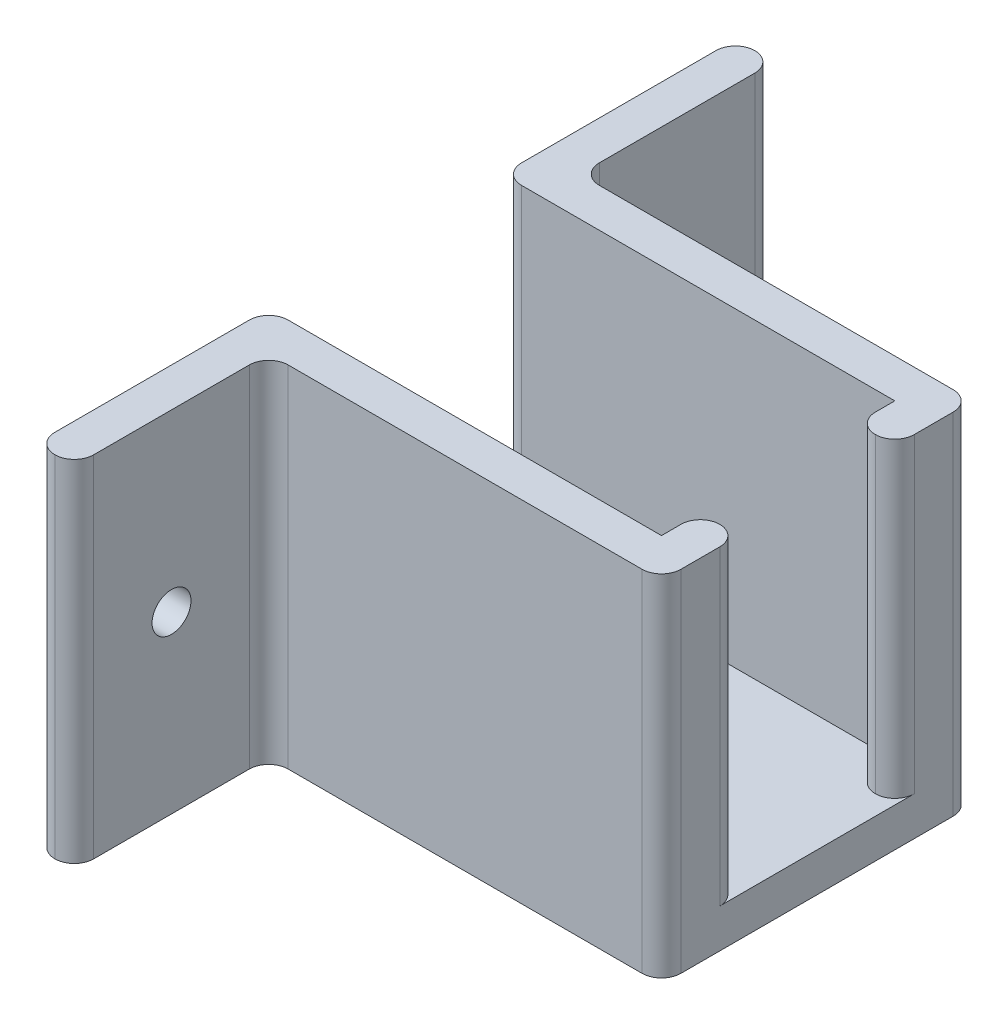
ISO-10303-21;
HEADER;
FILE_DESCRIPTION(('STEP AP214'),'2;1');
FILE_NAME('part.step','',(''),(''),'','','');
FILE_SCHEMA(('AUTOMOTIVE_DESIGN { 1 0 10303 214 1 1 1 1 }'));
ENDSEC;
DATA;
#1=APPLICATION_CONTEXT('core data for automotive mechanical design processes');
#2=APPLICATION_PROTOCOL_DEFINITION('international standard','automotive_design',2000,#1);
#3=PRODUCT_CONTEXT('',#1,'mechanical');
#4=PRODUCT('Part','Part','',(#3));
#5=PRODUCT_RELATED_PRODUCT_CATEGORY('part','',(#4));
#6=PRODUCT_DEFINITION_FORMATION('','',#4);
#7=PRODUCT_DEFINITION_CONTEXT('part definition',#1,'design');
#8=PRODUCT_DEFINITION('design','',#6,#7);
#9=PRODUCT_DEFINITION_SHAPE('','',#8);
#10=(LENGTH_UNIT() NAMED_UNIT(*) SI_UNIT(.MILLI.,.METRE.));
#11=(NAMED_UNIT(*) PLANE_ANGLE_UNIT() SI_UNIT($,.RADIAN.));
#12=(NAMED_UNIT(*) SI_UNIT($,.STERADIAN.) SOLID_ANGLE_UNIT());
#13=UNCERTAINTY_MEASURE_WITH_UNIT(LENGTH_MEASURE(1.E-05),#10,'distance_accuracy_value','');
#14=(GEOMETRIC_REPRESENTATION_CONTEXT(3) GLOBAL_UNCERTAINTY_ASSIGNED_CONTEXT((#13)) GLOBAL_UNIT_ASSIGNED_CONTEXT((#10,
#11,#12)) REPRESENTATION_CONTEXT('',''));
#15=CARTESIAN_POINT('',(0.,0.,0.));
#16=DIRECTION('',(0.,0.,1.));
#17=DIRECTION('',(1.,0.,0.));
#18=AXIS2_PLACEMENT_3D('',#15,#16,#17);
#19=CARTESIAN_POINT('',(0.,0.,0.));
#20=DIRECTION('',(0.,-1.,0.));
#21=DIRECTION('',(0.,0.,-1.));
#22=AXIS2_PLACEMENT_3D('',#19,#20,#21);
#23=PLANE('',#22);
#24=CARTESIAN_POINT('',(23.2,0.,-1.));
#25=DIRECTION('',(0.,-1.,0.));
#26=DIRECTION('',(0.,0.,-1.));
#27=AXIS2_PLACEMENT_3D('',#24,#25,#26);
#28=CIRCLE('',#27,1.);
#29=CARTESIAN_POINT('',(22.2,0.,-1.));
#30=VERTEX_POINT('',#29);
#31=CARTESIAN_POINT('',(23.2,0.,-2.));
#32=VERTEX_POINT('',#31);
#33=EDGE_CURVE('E52',#30,#32,#28,.T.);
#34=ORIENTED_EDGE('',*,*,#33,.T.);
#35=CARTESIAN_POINT('',(23.2,0.,-1.));
#36=DIRECTION('',(0.,-1.,0.));
#37=DIRECTION('',(0.,0.,-1.));
#38=AXIS2_PLACEMENT_3D('',#35,#36,#37);
#39=CIRCLE('',#38,1.);
#40=CARTESIAN_POINT('',(24.2,0.,-1.));
#41=VERTEX_POINT('',#40);
#42=EDGE_CURVE('E11',#32,#41,#39,.T.);
#43=ORIENTED_EDGE('',*,*,#42,.T.);
#44=DIRECTION('',(0.,0.,1.));
#45=VECTOR('',#44,1.);
#46=CARTESIAN_POINT('',(24.2,0.,0.));
#47=LINE('',#46,#45);
#48=CARTESIAN_POINT('',(24.2,0.,-11.));
#49=VERTEX_POINT('',#48);
#50=EDGE_CURVE('E252',#49,#41,#47,.T.);
#51=ORIENTED_EDGE('',*,*,#50,.F.);
#52=CARTESIAN_POINT('',(23.2,0.,-11.));
#53=DIRECTION('',(0.,-1.,0.));
#54=DIRECTION('',(0.,0.,-1.));
#55=AXIS2_PLACEMENT_3D('',#52,#53,#54);
#56=CIRCLE('',#55,1.);
#57=CARTESIAN_POINT('',(23.2,0.,-9.99999999999999));
#58=VERTEX_POINT('',#57);
#59=EDGE_CURVE('E65',#49,#58,#56,.T.);
#60=ORIENTED_EDGE('',*,*,#59,.T.);
#61=CARTESIAN_POINT('',(23.2,0.,-11.));
#62=DIRECTION('',(0.,-1.,0.));
#63=DIRECTION('',(0.,0.,-1.));
#64=AXIS2_PLACEMENT_3D('',#61,#62,#63);
#65=CIRCLE('',#64,1.);
#66=CARTESIAN_POINT('',(22.2,0.,-11.));
#67=VERTEX_POINT('',#66);
#68=EDGE_CURVE('E393',#58,#67,#65,.T.);
#69=ORIENTED_EDGE('',*,*,#68,.T.);
#70=DIRECTION('',(0.,0.,1.));
#71=VECTOR('',#70,1.);
#72=CARTESIAN_POINT('',(22.2,0.,0.));
#73=LINE('',#72,#71);
#74=CARTESIAN_POINT('',(22.2,0.,-12.));
#75=VERTEX_POINT('',#74);
#76=EDGE_CURVE('E253',#75,#67,#73,.T.);
#77=ORIENTED_EDGE('',*,*,#76,.F.);
#78=DIRECTION('',(1.,0.,0.));
#79=VECTOR('',#78,1.);
#80=CARTESIAN_POINT('',(0.,0.,-12.));
#81=LINE('',#80,#79);
#82=CARTESIAN_POINT('',(3.,0.,-12.));
#83=VERTEX_POINT('',#82);
#84=EDGE_CURVE('E250',#83,#75,#81,.T.);
#85=ORIENTED_EDGE('',*,*,#84,.F.);
#86=CARTESIAN_POINT('',(3.,0.,-13.));
#87=DIRECTION('',(0.,-1.,0.));
#88=DIRECTION('',(0.,0.,-1.));
#89=AXIS2_PLACEMENT_3D('',#86,#87,#88);
#90=CIRCLE('',#89,1.);
#91=CARTESIAN_POINT('',(2.,0.,-13.));
#92=VERTEX_POINT('',#91);
#93=EDGE_CURVE('E383',#83,#92,#90,.T.);
#94=ORIENTED_EDGE('',*,*,#93,.T.);
#95=DIRECTION('',(0.,0.,1.));
#96=VECTOR('',#95,1.);
#97=CARTESIAN_POINT('',(2.,0.,0.));
#98=LINE('',#97,#96);
#99=CARTESIAN_POINT('',(2.,0.,1.));
#100=VERTEX_POINT('',#99);
#101=EDGE_CURVE('E279',#92,#100,#98,.T.);
#102=ORIENTED_EDGE('',*,*,#101,.T.);
#103=CARTESIAN_POINT('',(3.,0.,1.));
#104=DIRECTION('',(0.,-1.,0.));
#105=DIRECTION('',(0.,0.,-1.));
#106=AXIS2_PLACEMENT_3D('',#103,#104,#105);
#107=CIRCLE('',#106,1.);
#108=CARTESIAN_POINT('',(3.,0.,0.));
#109=VERTEX_POINT('',#108);
#110=EDGE_CURVE('E386',#100,#109,#107,.T.);
#111=ORIENTED_EDGE('',*,*,#110,.T.);
#112=DIRECTION('',(-1.,0.,0.));
#113=VECTOR('',#112,1.);
#114=CARTESIAN_POINT('',(0.,0.,0.));
#115=LINE('',#114,#113);
#116=CARTESIAN_POINT('',(22.2,0.,0.));
#117=VERTEX_POINT('',#116);
#118=EDGE_CURVE('E238',#117,#109,#115,.T.);
#119=ORIENTED_EDGE('',*,*,#118,.F.);
#120=DIRECTION('',(0.,0.,1.));
#121=VECTOR('',#120,1.);
#122=CARTESIAN_POINT('',(22.2,0.,0.));
#123=LINE('',#122,#121);
#124=EDGE_CURVE('E234',#30,#117,#123,.T.);
#125=ORIENTED_EDGE('',*,*,#124,.F.);
#126=EDGE_LOOP('',(#34,#43,#51,#60,#69,#77,#85,#94,#102,#111,#119,#125));
#127=FACE_BOUND('',#126,.T.);
#128=ADVANCED_FACE('F43',(#127),#23,.F.);
#129=CARTESIAN_POINT('',(24.2,-2.,0.));
#130=DIRECTION('',(-1.,0.,0.));
#131=DIRECTION('',(0.,0.,1.));
#132=AXIS2_PLACEMENT_3D('',#129,#130,#131);
#133=PLANE('',#132);
#134=DIRECTION('',(0.,0.,1.));
#135=VECTOR('',#134,1.);
#136=CARTESIAN_POINT('',(24.2,-2.,0.));
#137=LINE('',#136,#135);
#138=CARTESIAN_POINT('',(24.2,-2.,-13.));
#139=VERTEX_POINT('',#138);
#140=CARTESIAN_POINT('',(24.2,-2.,1.));
#141=VERTEX_POINT('',#140);
#142=EDGE_CURVE('E275',#139,#141,#137,.T.);
#143=ORIENTED_EDGE('',*,*,#142,.F.);
#144=DIRECTION('',(0.,1.,0.));
#145=VECTOR('',#144,1.);
#146=CARTESIAN_POINT('',(24.2,-2.,-13.));
#147=LINE('',#146,#145);
#148=CARTESIAN_POINT('',(24.2,16.,-13.));
#149=VERTEX_POINT('',#148);
#150=EDGE_CURVE('E303',#139,#149,#147,.T.);
#151=ORIENTED_EDGE('',*,*,#150,.T.);
#152=DIRECTION('',(0.,0.,1.));
#153=VECTOR('',#152,1.);
#154=CARTESIAN_POINT('',(24.2,16.,0.));
#155=LINE('',#154,#153);
#156=CARTESIAN_POINT('',(24.2,16.,-11.));
#157=VERTEX_POINT('',#156);
#158=EDGE_CURVE('E265',#149,#157,#155,.T.);
#159=ORIENTED_EDGE('',*,*,#158,.T.);
#160=DIRECTION('',(0.,-1.,0.));
#161=VECTOR('',#160,1.);
#162=CARTESIAN_POINT('',(24.2,0.,-11.));
#163=LINE('',#162,#161);
#164=EDGE_CURVE('E298',#157,#49,#163,.T.);
#165=ORIENTED_EDGE('',*,*,#164,.T.);
#166=ORIENTED_EDGE('',*,*,#50,.T.);
#167=DIRECTION('',(0.,-1.,0.));
#168=VECTOR('',#167,1.);
#169=CARTESIAN_POINT('',(24.2,-2.,-1.));
#170=LINE('',#169,#168);
#171=CARTESIAN_POINT('',(24.2,16.,-1.));
#172=VERTEX_POINT('',#171);
#173=EDGE_CURVE('E294',#41,#172,#170,.F.);
#174=ORIENTED_EDGE('',*,*,#173,.T.);
#175=DIRECTION('',(0.,0.,1.));
#176=VECTOR('',#175,1.);
#177=CARTESIAN_POINT('',(24.2,16.,0.));
#178=LINE('',#177,#176);
#179=CARTESIAN_POINT('',(24.2,16.,1.));
#180=VERTEX_POINT('',#179);
#181=EDGE_CURVE('E420',#172,#180,#178,.T.);
#182=ORIENTED_EDGE('',*,*,#181,.T.);
#183=DIRECTION('',(0.,1.,0.));
#184=VECTOR('',#183,1.);
#185=CARTESIAN_POINT('',(24.2,-2.,1.));
#186=LINE('',#185,#184);
#187=EDGE_CURVE('E301',#180,#141,#186,.F.);
#188=ORIENTED_EDGE('',*,*,#187,.T.);
#189=EDGE_LOOP('',(#143,#151,#159,#165,#166,#174,#182,#188));
#190=FACE_BOUND('',#189,.T.);
#191=ADVANCED_FACE('F457',(#190),#133,.F.);
#192=CARTESIAN_POINT('',(0.,-2.,2.));
#193=DIRECTION('',(0.,0.,-1.));
#194=DIRECTION('',(-1.,0.,0.));
#195=AXIS2_PLACEMENT_3D('',#192,#193,#194);
#196=PLANE('',#195);
#197=DIRECTION('',(-1.,0.,0.));
#198=VECTOR('',#197,1.);
#199=CARTESIAN_POINT('',(0.,-2.,2.));
#200=LINE('',#199,#198);
#201=CARTESIAN_POINT('',(23.2,-2.,2.));
#202=VERTEX_POINT('',#201);
#203=CARTESIAN_POINT('',(5.,-2.,2.));
#204=VERTEX_POINT('',#203);
#205=EDGE_CURVE('E278',#202,#204,#200,.T.);
#206=ORIENTED_EDGE('',*,*,#205,.F.);
#207=DIRECTION('',(0.,1.,0.));
#208=VECTOR('',#207,1.);
#209=CARTESIAN_POINT('',(23.2,-2.,2.));
#210=LINE('',#209,#208);
#211=CARTESIAN_POINT('',(23.2,16.,2.));
#212=VERTEX_POINT('',#211);
#213=EDGE_CURVE('E337',#202,#212,#210,.T.);
#214=ORIENTED_EDGE('',*,*,#213,.T.);
#215=DIRECTION('',(-1.,0.,0.));
#216=VECTOR('',#215,1.);
#217=CARTESIAN_POINT('',(0.,16.,2.));
#218=LINE('',#217,#216);
#219=CARTESIAN_POINT('',(5.,16.,2.));
#220=VERTEX_POINT('',#219);
#221=EDGE_CURVE('E399',#212,#220,#218,.T.);
#222=ORIENTED_EDGE('',*,*,#221,.T.);
#223=DIRECTION('',(0.,1.,0.));
#224=VECTOR('',#223,1.);
#225=CARTESIAN_POINT('',(5.,-2.,2.));
#226=LINE('',#225,#224);
#227=EDGE_CURVE('E335',#220,#204,#226,.F.);
#228=ORIENTED_EDGE('',*,*,#227,.T.);
#229=EDGE_LOOP('',(#206,#214,#222,#228));
#230=FACE_BOUND('',#229,.T.);
#231=ADVANCED_FACE('F447',(#230),#196,.F.);
#232=CARTESIAN_POINT('',(4.,-2.,0.));
#233=DIRECTION('',(1.,0.,0.));
#234=DIRECTION('',(0.,0.,-1.));
#235=AXIS2_PLACEMENT_3D('',#232,#233,#234);
#236=PLANE('',#235);
#237=CARTESIAN_POINT('',(4.,7.,7.));
#238=DIRECTION('',(1.,0.,0.));
#239=DIRECTION('',(0.,0.,-1.));
#240=AXIS2_PLACEMENT_3D('',#237,#238,#239);
#241=CIRCLE('',#240,1.);
#242=CARTESIAN_POINT('',(4.,7.,6.));
#243=VERTEX_POINT('',#242);
#244=EDGE_CURVE('E407',#243,#243,#241,.T.);
#245=ORIENTED_EDGE('',*,*,#244,.F.);
#246=EDGE_LOOP('',(#245));
#247=FACE_BOUND('',#246,.T.);
#248=DIRECTION('',(0.,0.,-1.));
#249=VECTOR('',#248,1.);
#250=CARTESIAN_POINT('',(4.,16.,0.));
#251=LINE('',#250,#249);
#252=CARTESIAN_POINT('',(4.,16.,11.));
#253=VERTEX_POINT('',#252);
#254=CARTESIAN_POINT('',(4.,16.,3.));
#255=VERTEX_POINT('',#254);
#256=EDGE_CURVE('E229',#253,#255,#251,.T.);
#257=ORIENTED_EDGE('',*,*,#256,.F.);
#258=DIRECTION('',(0.,1.,0.));
#259=VECTOR('',#258,1.);
#260=CARTESIAN_POINT('',(4.,-2.,11.));
#261=LINE('',#260,#259);
#262=CARTESIAN_POINT('',(4.,-2.,11.));
#263=VERTEX_POINT('',#262);
#264=EDGE_CURVE('E373',#253,#263,#261,.F.);
#265=ORIENTED_EDGE('',*,*,#264,.T.);
#266=DIRECTION('',(0.,0.,-1.));
#267=VECTOR('',#266,1.);
#268=CARTESIAN_POINT('',(4.,-2.,0.));
#269=LINE('',#268,#267);
#270=CARTESIAN_POINT('',(4.,-2.,3.));
#271=VERTEX_POINT('',#270);
#272=EDGE_CURVE('E282',#263,#271,#269,.T.);
#273=ORIENTED_EDGE('',*,*,#272,.T.);
#274=DIRECTION('',(0.,1.,0.));
#275=VECTOR('',#274,1.);
#276=CARTESIAN_POINT('',(4.,-2.,3.));
#277=LINE('',#276,#275);
#278=EDGE_CURVE('E370',#271,#255,#277,.T.);
#279=ORIENTED_EDGE('',*,*,#278,.T.);
#280=EDGE_LOOP('',(#257,#265,#273,#279));
#281=FACE_BOUND('',#280,.T.);
#282=ADVANCED_FACE('F430',(#247,#281),#236,.T.);
#283=CARTESIAN_POINT('',(2.,-2.,0.));
#284=DIRECTION('',(-1.,0.,0.));
#285=DIRECTION('',(0.,0.,1.));
#286=AXIS2_PLACEMENT_3D('',#283,#284,#285);
#287=PLANE('',#286);
#288=CARTESIAN_POINT('',(2.,6.99999999999999,-19.));
#289=DIRECTION('',(-1.,0.,0.));
#290=DIRECTION('',(0.,0.,1.));
#291=AXIS2_PLACEMENT_3D('',#288,#289,#290);
#292=CIRCLE('',#291,1.);
#293=CARTESIAN_POINT('',(2.,6.99999999999999,-18.));
#294=VERTEX_POINT('',#293);
#295=EDGE_CURVE('E415',#294,#294,#292,.T.);
#296=ORIENTED_EDGE('',*,*,#295,.F.);
#297=EDGE_LOOP('',(#296));
#298=FACE_BOUND('',#297,.T.);
#299=CARTESIAN_POINT('',(2.,7.,7.));
#300=DIRECTION('',(-1.,0.,0.));
#301=DIRECTION('',(0.,0.,1.));
#302=AXIS2_PLACEMENT_3D('',#299,#300,#301);
#303=CIRCLE('',#302,1.);
#304=CARTESIAN_POINT('',(2.,7.,8.));
#305=VERTEX_POINT('',#304);
#306=EDGE_CURVE('E418',#305,#305,#303,.T.);
#307=ORIENTED_EDGE('',*,*,#306,.F.);
#308=EDGE_LOOP('',(#307));
#309=FACE_BOUND('',#308,.T.);
#310=DIRECTION('',(0.,0.,1.));
#311=VECTOR('',#310,1.);
#312=CARTESIAN_POINT('',(2.,16.,0.));
#313=LINE('',#312,#311);
#314=CARTESIAN_POINT('',(2.,16.,-23.));
#315=VERTEX_POINT('',#314);
#316=CARTESIAN_POINT('',(2.,16.,-13.));
#317=VERTEX_POINT('',#316);
#318=EDGE_CURVE('E228',#315,#317,#313,.T.);
#319=ORIENTED_EDGE('',*,*,#318,.F.);
#320=DIRECTION('',(0.,1.,0.));
#321=VECTOR('',#320,1.);
#322=CARTESIAN_POINT('',(2.,-2.,-23.));
#323=LINE('',#322,#321);
#324=CARTESIAN_POINT('',(2.,-2.,-23.));
#325=VERTEX_POINT('',#324);
#326=EDGE_CURVE('E359',#315,#325,#323,.F.);
#327=ORIENTED_EDGE('',*,*,#326,.T.);
#328=DIRECTION('',(0.,0.,1.));
#329=VECTOR('',#328,1.);
#330=CARTESIAN_POINT('',(2.,-2.,0.));
#331=LINE('',#330,#329);
#332=CARTESIAN_POINT('',(2.,-2.,11.));
#333=VERTEX_POINT('',#332);
#334=EDGE_CURVE('E285',#325,#333,#331,.T.);
#335=ORIENTED_EDGE('',*,*,#334,.T.);
#336=DIRECTION('',(0.,1.,0.));
#337=VECTOR('',#336,1.);
#338=CARTESIAN_POINT('',(2.,-2.,11.));
#339=LINE('',#338,#337);
#340=CARTESIAN_POINT('',(2.,16.,11.));
#341=VERTEX_POINT('',#340);
#342=EDGE_CURVE('E351',#333,#341,#339,.T.);
#343=ORIENTED_EDGE('',*,*,#342,.T.);
#344=DIRECTION('',(0.,0.,1.));
#345=VECTOR('',#344,1.);
#346=CARTESIAN_POINT('',(2.,16.,0.));
#347=LINE('',#346,#345);
#348=CARTESIAN_POINT('',(2.,16.,1.));
#349=VERTEX_POINT('',#348);
#350=EDGE_CURVE('E243',#349,#341,#347,.T.);
#351=ORIENTED_EDGE('',*,*,#350,.F.);
#352=DIRECTION('',(0.,-1.,0.));
#353=VECTOR('',#352,1.);
#354=CARTESIAN_POINT('',(2.,0.,1.));
#355=LINE('',#354,#353);
#356=EDGE_CURVE('E354',#349,#100,#355,.T.);
#357=ORIENTED_EDGE('',*,*,#356,.T.);
#358=ORIENTED_EDGE('',*,*,#101,.F.);
#359=DIRECTION('',(0.,-1.,0.));
#360=VECTOR('',#359,1.);
#361=CARTESIAN_POINT('',(2.,16.,-13.));
#362=LINE('',#361,#360);
#363=EDGE_CURVE('E357',#92,#317,#362,.F.);
#364=ORIENTED_EDGE('',*,*,#363,.T.);
#365=EDGE_LOOP('',(#319,#327,#335,#343,#351,#357,#358,#364));
#366=FACE_BOUND('',#365,.T.);
#367=ADVANCED_FACE('F468',(#298,#309,#366),#287,.T.);
#368=CARTESIAN_POINT('',(4.00000000000001,-2.,0.));
#369=DIRECTION('',(-1.,0.,0.));
#370=DIRECTION('',(0.,0.,1.));
#371=AXIS2_PLACEMENT_3D('',#368,#369,#370);
#372=PLANE('',#371);
#373=CARTESIAN_POINT('',(4.00000000000001,6.99999999999999,-19.));
#374=DIRECTION('',(-1.,0.,0.));
#375=DIRECTION('',(0.,0.,1.));
#376=AXIS2_PLACEMENT_3D('',#373,#374,#375);
#377=CIRCLE('',#376,1.);
#378=CARTESIAN_POINT('',(4.00000000000001,6.99999999999999,-18.));
#379=VERTEX_POINT('',#378);
#380=EDGE_CURVE('E47',#379,#379,#377,.T.);
#381=ORIENTED_EDGE('',*,*,#380,.T.);
#382=EDGE_LOOP('',(#381));
#383=FACE_BOUND('',#382,.T.);
#384=DIRECTION('',(0.,0.,1.));
#385=VECTOR('',#384,1.);
#386=CARTESIAN_POINT('',(4.00000000000001,-2.,0.));
#387=LINE('',#386,#385);
#388=CARTESIAN_POINT('',(4.00000000000001,-2.,-23.));
#389=VERTEX_POINT('',#388);
#390=CARTESIAN_POINT('',(4.00000000000001,-2.,-15.));
#391=VERTEX_POINT('',#390);
#392=EDGE_CURVE('E288',#389,#391,#387,.T.);
#393=ORIENTED_EDGE('',*,*,#392,.F.);
#394=DIRECTION('',(0.,1.,0.));
#395=VECTOR('',#394,1.);
#396=CARTESIAN_POINT('',(4.00000000000001,-2.,-23.));
#397=LINE('',#396,#395);
#398=CARTESIAN_POINT('',(4.00000000000001,16.,-23.));
#399=VERTEX_POINT('',#398);
#400=EDGE_CURVE('E364',#389,#399,#397,.T.);
#401=ORIENTED_EDGE('',*,*,#400,.T.);
#402=DIRECTION('',(0.,0.,1.));
#403=VECTOR('',#402,1.);
#404=CARTESIAN_POINT('',(4.00000000000001,16.,0.));
#405=LINE('',#404,#403);
#406=CARTESIAN_POINT('',(4.00000000000001,16.,-15.));
#407=VERTEX_POINT('',#406);
#408=EDGE_CURVE('E264',#399,#407,#405,.T.);
#409=ORIENTED_EDGE('',*,*,#408,.T.);
#410=DIRECTION('',(0.,1.,0.));
#411=VECTOR('',#410,1.);
#412=CARTESIAN_POINT('',(4.00000000000001,-2.,-15.));
#413=LINE('',#412,#411);
#414=EDGE_CURVE('E362',#407,#391,#413,.F.);
#415=ORIENTED_EDGE('',*,*,#414,.T.);
#416=EDGE_LOOP('',(#393,#401,#409,#415));
#417=FACE_BOUND('',#416,.T.);
#418=ADVANCED_FACE('F497',(#383,#417),#372,.F.);
#419=CARTESIAN_POINT('',(0.,-2.,-14.));
#420=DIRECTION('',(0.,0.,1.));
#421=DIRECTION('',(1.,0.,0.));
#422=AXIS2_PLACEMENT_3D('',#419,#420,#421);
#423=PLANE('',#422);
#424=DIRECTION('',(1.,0.,0.));
#425=VECTOR('',#424,1.);
#426=CARTESIAN_POINT('',(0.,16.,-14.));
#427=LINE('',#426,#425);
#428=CARTESIAN_POINT('',(5.00000000000001,16.,-14.));
#429=VERTEX_POINT('',#428);
#430=CARTESIAN_POINT('',(23.2,16.,-14.));
#431=VERTEX_POINT('',#430);
#432=EDGE_CURVE('E268',#429,#431,#427,.T.);
#433=ORIENTED_EDGE('',*,*,#432,.T.);
#434=DIRECTION('',(0.,1.,0.));
#435=VECTOR('',#434,1.);
#436=CARTESIAN_POINT('',(23.2,-2.,-14.));
#437=LINE('',#436,#435);
#438=CARTESIAN_POINT('',(23.2,-2.,-14.));
#439=VERTEX_POINT('',#438);
#440=EDGE_CURVE('E321',#431,#439,#437,.F.);
#441=ORIENTED_EDGE('',*,*,#440,.T.);
#442=DIRECTION('',(1.,0.,0.));
#443=VECTOR('',#442,1.);
#444=CARTESIAN_POINT('',(0.,-2.,-14.));
#445=LINE('',#444,#443);
#446=CARTESIAN_POINT('',(5.00000000000001,-2.,-14.));
#447=VERTEX_POINT('',#446);
#448=EDGE_CURVE('E291',#447,#439,#445,.T.);
#449=ORIENTED_EDGE('',*,*,#448,.F.);
#450=DIRECTION('',(0.,1.,0.));
#451=VECTOR('',#450,1.);
#452=CARTESIAN_POINT('',(5.00000000000001,16.,-14.));
#453=LINE('',#452,#451);
#454=EDGE_CURVE('E318',#447,#429,#453,.T.);
#455=ORIENTED_EDGE('',*,*,#454,.T.);
#456=EDGE_LOOP('',(#433,#441,#449,#455));
#457=FACE_BOUND('',#456,.T.);
#458=ADVANCED_FACE('F494',(#457),#423,.F.);
#459=CARTESIAN_POINT('',(0.,-2.,0.));
#460=DIRECTION('',(0.,-1.,0.));
#461=DIRECTION('',(0.,0.,-1.));
#462=AXIS2_PLACEMENT_3D('',#459,#460,#461);
#463=PLANE('',#462);
#464=ORIENTED_EDGE('',*,*,#448,.T.);
#465=CARTESIAN_POINT('',(23.2,-2.,-13.));
#466=DIRECTION('',(0.,-1.,0.));
#467=DIRECTION('',(0.,0.,-1.));
#468=AXIS2_PLACEMENT_3D('',#465,#466,#467);
#469=CIRCLE('',#468,1.);
#470=EDGE_CURVE('E333',#439,#139,#469,.T.);
#471=ORIENTED_EDGE('',*,*,#470,.T.);
#472=ORIENTED_EDGE('',*,*,#142,.T.);
#473=CARTESIAN_POINT('',(23.2,-2.,1.));
#474=DIRECTION('',(0.,-1.,0.));
#475=DIRECTION('',(0.,0.,-1.));
#476=AXIS2_PLACEMENT_3D('',#473,#474,#475);
#477=CIRCLE('',#476,1.);
#478=EDGE_CURVE('E331',#141,#202,#477,.T.);
#479=ORIENTED_EDGE('',*,*,#478,.T.);
#480=ORIENTED_EDGE('',*,*,#205,.T.);
#481=CARTESIAN_POINT('',(5.,-2.,3.));
#482=DIRECTION('',(0.,-1.,0.));
#483=DIRECTION('',(0.,0.,-1.));
#484=AXIS2_PLACEMENT_3D('',#481,#482,#483);
#485=CIRCLE('',#484,1.);
#486=EDGE_CURVE('E390',#204,#271,#485,.F.);
#487=ORIENTED_EDGE('',*,*,#486,.T.);
#488=ORIENTED_EDGE('',*,*,#272,.F.);
#489=CARTESIAN_POINT('',(3.,-2.,11.));
#490=DIRECTION('',(0.,-1.,0.));
#491=DIRECTION('',(0.,0.,-1.));
#492=AXIS2_PLACEMENT_3D('',#489,#490,#491);
#493=CIRCLE('',#492,1.);
#494=CARTESIAN_POINT('',(3.,-2.,12.));
#495=VERTEX_POINT('',#494);
#496=EDGE_CURVE('E323',#263,#495,#493,.T.);
#497=ORIENTED_EDGE('',*,*,#496,.T.);
#498=CARTESIAN_POINT('',(3.,-2.,11.));
#499=DIRECTION('',(0.,-1.,0.));
#500=DIRECTION('',(0.,0.,-1.));
#501=AXIS2_PLACEMENT_3D('',#498,#499,#500);
#502=CIRCLE('',#501,1.);
#503=EDGE_CURVE('E325',#495,#333,#502,.T.);
#504=ORIENTED_EDGE('',*,*,#503,.T.);
#505=ORIENTED_EDGE('',*,*,#334,.F.);
#506=CARTESIAN_POINT('',(3.,-2.,-23.));
#507=DIRECTION('',(0.,-1.,0.));
#508=DIRECTION('',(0.,0.,-1.));
#509=AXIS2_PLACEMENT_3D('',#506,#507,#508);
#510=CIRCLE('',#509,1.);
#511=CARTESIAN_POINT('',(3.00000000000001,-2.,-24.));
#512=VERTEX_POINT('',#511);
#513=EDGE_CURVE('E329',#325,#512,#510,.T.);
#514=ORIENTED_EDGE('',*,*,#513,.T.);
#515=CARTESIAN_POINT('',(3.00000000000001,-2.,-23.));
#516=DIRECTION('',(0.,-1.,0.));
#517=DIRECTION('',(0.,0.,-1.));
#518=AXIS2_PLACEMENT_3D('',#515,#516,#517);
#519=CIRCLE('',#518,1.);
#520=EDGE_CURVE('E327',#512,#389,#519,.T.);
#521=ORIENTED_EDGE('',*,*,#520,.T.);
#522=ORIENTED_EDGE('',*,*,#392,.T.);
#523=CARTESIAN_POINT('',(5.00000000000001,-2.,-15.));
#524=DIRECTION('',(0.,-1.,0.));
#525=DIRECTION('',(0.,0.,-1.));
#526=AXIS2_PLACEMENT_3D('',#523,#524,#525);
#527=CIRCLE('',#526,1.);
#528=EDGE_CURVE('E381',#391,#447,#527,.F.);
#529=ORIENTED_EDGE('',*,*,#528,.T.);
#530=EDGE_LOOP('',(#464,#471,#472,#479,#480,#487,#488,#497,#504,#505,#514,#521,#522,#529));
#531=FACE_BOUND('',#530,.T.);
#532=ADVANCED_FACE('F439',(#531),#463,.T.);
#533=CARTESIAN_POINT('',(0.,16.,0.));
#534=DIRECTION('',(0.,1.,0.));
#535=DIRECTION('',(0.,0.,1.));
#536=AXIS2_PLACEMENT_3D('',#533,#534,#535);
#537=PLANE('',#536);
#538=ORIENTED_EDGE('',*,*,#158,.F.);
#539=CARTESIAN_POINT('',(23.2,16.,-13.));
#540=DIRECTION('',(0.,1.,0.));
#541=DIRECTION('',(0.,0.,1.));
#542=AXIS2_PLACEMENT_3D('',#539,#540,#541);
#543=CIRCLE('',#542,1.);
#544=EDGE_CURVE('E316',#149,#431,#543,.T.);
#545=ORIENTED_EDGE('',*,*,#544,.T.);
#546=ORIENTED_EDGE('',*,*,#432,.F.);
#547=CARTESIAN_POINT('',(5.00000000000001,16.,-15.));
#548=DIRECTION('',(0.,1.,0.));
#549=DIRECTION('',(0.,0.,1.));
#550=AXIS2_PLACEMENT_3D('',#547,#548,#549);
#551=CIRCLE('',#550,1.);
#552=EDGE_CURVE('E379',#429,#407,#551,.F.);
#553=ORIENTED_EDGE('',*,*,#552,.T.);
#554=ORIENTED_EDGE('',*,*,#408,.F.);
#555=CARTESIAN_POINT('',(3.00000000000001,16.,-23.));
#556=DIRECTION('',(0.,1.,0.));
#557=DIRECTION('',(0.,0.,1.));
#558=AXIS2_PLACEMENT_3D('',#555,#556,#557);
#559=CIRCLE('',#558,1.);
#560=CARTESIAN_POINT('',(3.00000000000001,16.,-24.));
#561=VERTEX_POINT('',#560);
#562=EDGE_CURVE('E312',#399,#561,#559,.T.);
#563=ORIENTED_EDGE('',*,*,#562,.T.);
#564=CARTESIAN_POINT('',(3.,16.,-23.));
#565=DIRECTION('',(0.,1.,0.));
#566=DIRECTION('',(0.,0.,1.));
#567=AXIS2_PLACEMENT_3D('',#564,#565,#566);
#568=CIRCLE('',#567,1.);
#569=EDGE_CURVE('E314',#561,#315,#568,.T.);
#570=ORIENTED_EDGE('',*,*,#569,.T.);
#571=ORIENTED_EDGE('',*,*,#318,.T.);
#572=CARTESIAN_POINT('',(3.,16.,-13.));
#573=DIRECTION('',(0.,1.,0.));
#574=DIRECTION('',(0.,0.,1.));
#575=AXIS2_PLACEMENT_3D('',#572,#573,#574);
#576=CIRCLE('',#575,1.);
#577=CARTESIAN_POINT('',(3.,16.,-12.));
#578=VERTEX_POINT('',#577);
#579=EDGE_CURVE('E310',#317,#578,#576,.T.);
#580=ORIENTED_EDGE('',*,*,#579,.T.);
#581=DIRECTION('',(1.,0.,0.));
#582=VECTOR('',#581,1.);
#583=CARTESIAN_POINT('',(0.,16.,-12.));
#584=LINE('',#583,#582);
#585=CARTESIAN_POINT('',(22.2,16.,-12.));
#586=VERTEX_POINT('',#585);
#587=EDGE_CURVE('E259',#578,#586,#584,.T.);
#588=ORIENTED_EDGE('',*,*,#587,.T.);
#589=DIRECTION('',(0.,0.,1.));
#590=VECTOR('',#589,1.);
#591=CARTESIAN_POINT('',(22.2,16.,0.));
#592=LINE('',#591,#590);
#593=CARTESIAN_POINT('',(22.2,16.,-11.));
#594=VERTEX_POINT('',#593);
#595=EDGE_CURVE('E261',#586,#594,#592,.T.);
#596=ORIENTED_EDGE('',*,*,#595,.T.);
#597=CARTESIAN_POINT('',(23.2,16.,-11.));
#598=DIRECTION('',(0.,1.,0.));
#599=DIRECTION('',(0.,0.,1.));
#600=AXIS2_PLACEMENT_3D('',#597,#598,#599);
#601=CIRCLE('',#600,1.);
#602=CARTESIAN_POINT('',(23.2,16.,-9.99999999999999));
#603=VERTEX_POINT('',#602);
#604=EDGE_CURVE('E306',#594,#603,#601,.T.);
#605=ORIENTED_EDGE('',*,*,#604,.T.);
#606=CARTESIAN_POINT('',(23.2,16.,-11.));
#607=DIRECTION('',(0.,1.,0.));
#608=DIRECTION('',(0.,0.,1.));
#609=AXIS2_PLACEMENT_3D('',#606,#607,#608);
#610=CIRCLE('',#609,1.);
#611=EDGE_CURVE('E308',#603,#157,#610,.T.);
#612=ORIENTED_EDGE('',*,*,#611,.T.);
#613=EDGE_LOOP('',(#538,#545,#546,#553,#554,#563,#570,#571,#580,#588,#596,#605,#612));
#614=FACE_BOUND('',#613,.T.);
#615=ADVANCED_FACE('F709',(#614),#537,.T.);
#616=CARTESIAN_POINT('',(22.2,42.2457615625838,0.));
#617=DIRECTION('',(1.,0.,0.));
#618=DIRECTION('',(0.,0.,-1.));
#619=AXIS2_PLACEMENT_3D('',#616,#617,#618);
#620=PLANE('',#619);
#621=ORIENTED_EDGE('',*,*,#76,.T.);
#622=DIRECTION('',(0.,-1.,0.));
#623=VECTOR('',#622,1.);
#624=CARTESIAN_POINT('',(22.2,16.,-11.));
#625=LINE('',#624,#623);
#626=EDGE_CURVE('E375',#67,#594,#625,.F.);
#627=ORIENTED_EDGE('',*,*,#626,.T.);
#628=ORIENTED_EDGE('',*,*,#595,.F.);
#629=DIRECTION('',(0.,-1.,0.));
#630=VECTOR('',#629,1.);
#631=CARTESIAN_POINT('',(22.2,42.2457615625838,-12.));
#632=LINE('',#631,#630);
#633=EDGE_CURVE('E256',#586,#75,#632,.T.);
#634=ORIENTED_EDGE('',*,*,#633,.T.);
#635=EDGE_LOOP('',(#621,#627,#628,#634));
#636=FACE_BOUND('',#635,.T.);
#637=ADVANCED_FACE('F700',(#636),#620,.F.);
#638=CARTESIAN_POINT('',(0.,42.2457615625838,-12.));
#639=DIRECTION('',(0.,0.,-1.));
#640=DIRECTION('',(-1.,0.,0.));
#641=AXIS2_PLACEMENT_3D('',#638,#639,#640);
#642=PLANE('',#641);
#643=ORIENTED_EDGE('',*,*,#587,.F.);
#644=DIRECTION('',(0.,-1.,0.));
#645=VECTOR('',#644,1.);
#646=CARTESIAN_POINT('',(3.,0.,-12.));
#647=LINE('',#646,#645);
#648=EDGE_CURVE('E366',#578,#83,#647,.T.);
#649=ORIENTED_EDGE('',*,*,#648,.T.);
#650=ORIENTED_EDGE('',*,*,#84,.T.);
#651=ORIENTED_EDGE('',*,*,#633,.F.);
#652=EDGE_LOOP('',(#643,#649,#650,#651));
#653=FACE_BOUND('',#652,.T.);
#654=ADVANCED_FACE('F687',(#653),#642,.F.);
#655=CARTESIAN_POINT('',(22.2,42.2457615625838,0.));
#656=DIRECTION('',(1.,0.,0.));
#657=DIRECTION('',(0.,0.,-1.));
#658=AXIS2_PLACEMENT_3D('',#655,#656,#657);
#659=PLANE('',#658);
#660=DIRECTION('',(0.,0.,1.));
#661=VECTOR('',#660,1.);
#662=CARTESIAN_POINT('',(22.2,16.,0.));
#663=LINE('',#662,#661);
#664=CARTESIAN_POINT('',(22.2,16.,-1.));
#665=VERTEX_POINT('',#664);
#666=CARTESIAN_POINT('',(22.2,16.,0.));
#667=VERTEX_POINT('',#666);
#668=EDGE_CURVE('E216',#665,#667,#663,.T.);
#669=ORIENTED_EDGE('',*,*,#668,.F.);
#670=DIRECTION('',(0.,-1.,0.));
#671=VECTOR('',#670,1.);
#672=CARTESIAN_POINT('',(22.2,42.2457615625838,-1.));
#673=LINE('',#672,#671);
#674=EDGE_CURVE('E377',#665,#30,#673,.T.);
#675=ORIENTED_EDGE('',*,*,#674,.T.);
#676=ORIENTED_EDGE('',*,*,#124,.T.);
#677=DIRECTION('',(0.,-1.,0.));
#678=VECTOR('',#677,1.);
#679=CARTESIAN_POINT('',(22.2,42.2457615625838,0.));
#680=LINE('',#679,#678);
#681=EDGE_CURVE('E232',#667,#117,#680,.T.);
#682=ORIENTED_EDGE('',*,*,#681,.F.);
#683=EDGE_LOOP('',(#669,#675,#676,#682));
#684=FACE_BOUND('',#683,.T.);
#685=ADVANCED_FACE('F233',(#684),#659,.F.);
#686=CARTESIAN_POINT('',(0.,42.2457615625838,0.));
#687=DIRECTION('',(0.,0.,1.));
#688=DIRECTION('',(1.,0.,0.));
#689=AXIS2_PLACEMENT_3D('',#686,#687,#688);
#690=PLANE('',#689);
#691=ORIENTED_EDGE('',*,*,#118,.T.);
#692=DIRECTION('',(0.,-1.,0.));
#693=VECTOR('',#692,1.);
#694=CARTESIAN_POINT('',(3.,16.,0.));
#695=LINE('',#694,#693);
#696=CARTESIAN_POINT('',(3.,16.,0.));
#697=VERTEX_POINT('',#696);
#698=EDGE_CURVE('E242',#109,#697,#695,.F.);
#699=ORIENTED_EDGE('',*,*,#698,.T.);
#700=DIRECTION('',(-1.,0.,0.));
#701=VECTOR('',#700,1.);
#702=CARTESIAN_POINT('',(0.,16.,0.));
#703=LINE('',#702,#701);
#704=EDGE_CURVE('E221',#667,#697,#703,.T.);
#705=ORIENTED_EDGE('',*,*,#704,.F.);
#706=ORIENTED_EDGE('',*,*,#681,.T.);
#707=EDGE_LOOP('',(#691,#699,#705,#706));
#708=FACE_BOUND('',#707,.T.);
#709=ADVANCED_FACE('F240',(#708),#690,.F.);
#710=CARTESIAN_POINT('',(0.,16.,0.));
#711=DIRECTION('',(0.,1.,0.));
#712=DIRECTION('',(0.,0.,1.));
#713=AXIS2_PLACEMENT_3D('',#710,#711,#712);
#714=PLANE('',#713);
#715=ORIENTED_EDGE('',*,*,#221,.F.);
#716=CARTESIAN_POINT('',(23.2,16.,1.));
#717=DIRECTION('',(0.,1.,0.));
#718=DIRECTION('',(0.,0.,1.));
#719=AXIS2_PLACEMENT_3D('',#716,#717,#718);
#720=CIRCLE('',#719,1.);
#721=EDGE_CURVE('E349',#212,#180,#720,.T.);
#722=ORIENTED_EDGE('',*,*,#721,.T.);
#723=ORIENTED_EDGE('',*,*,#181,.F.);
#724=CARTESIAN_POINT('',(23.2,16.,-1.));
#725=DIRECTION('',(0.,1.,0.));
#726=DIRECTION('',(0.,0.,1.));
#727=AXIS2_PLACEMENT_3D('',#724,#725,#726);
#728=CIRCLE('',#727,1.);
#729=CARTESIAN_POINT('',(23.2,16.,-2.));
#730=VERTEX_POINT('',#729);
#731=EDGE_CURVE('E340',#172,#730,#728,.T.);
#732=ORIENTED_EDGE('',*,*,#731,.T.);
#733=CARTESIAN_POINT('',(23.2,16.,-1.));
#734=DIRECTION('',(0.,1.,0.));
#735=DIRECTION('',(0.,0.,1.));
#736=AXIS2_PLACEMENT_3D('',#733,#734,#735);
#737=CIRCLE('',#736,1.);
#738=EDGE_CURVE('E224',#730,#665,#737,.T.);
#739=ORIENTED_EDGE('',*,*,#738,.T.);
#740=ORIENTED_EDGE('',*,*,#668,.T.);
#741=ORIENTED_EDGE('',*,*,#704,.T.);
#742=CARTESIAN_POINT('',(3.,16.,1.));
#743=DIRECTION('',(0.,1.,0.));
#744=DIRECTION('',(0.,0.,1.));
#745=AXIS2_PLACEMENT_3D('',#742,#743,#744);
#746=CIRCLE('',#745,1.);
#747=EDGE_CURVE('E347',#697,#349,#746,.T.);
#748=ORIENTED_EDGE('',*,*,#747,.T.);
#749=ORIENTED_EDGE('',*,*,#350,.T.);
#750=CARTESIAN_POINT('',(3.,16.,11.));
#751=DIRECTION('',(0.,1.,0.));
#752=DIRECTION('',(0.,0.,1.));
#753=AXIS2_PLACEMENT_3D('',#750,#751,#752);
#754=CIRCLE('',#753,1.);
#755=CARTESIAN_POINT('',(3.,16.,12.));
#756=VERTEX_POINT('',#755);
#757=EDGE_CURVE('E345',#341,#756,#754,.T.);
#758=ORIENTED_EDGE('',*,*,#757,.T.);
#759=CARTESIAN_POINT('',(3.,16.,11.));
#760=DIRECTION('',(0.,1.,0.));
#761=DIRECTION('',(0.,0.,1.));
#762=AXIS2_PLACEMENT_3D('',#759,#760,#761);
#763=CIRCLE('',#762,1.);
#764=EDGE_CURVE('E343',#756,#253,#763,.T.);
#765=ORIENTED_EDGE('',*,*,#764,.T.);
#766=ORIENTED_EDGE('',*,*,#256,.T.);
#767=CARTESIAN_POINT('',(5.,16.,3.));
#768=DIRECTION('',(0.,1.,0.));
#769=DIRECTION('',(0.,0.,1.));
#770=AXIS2_PLACEMENT_3D('',#767,#768,#769);
#771=CIRCLE('',#770,1.);
#772=EDGE_CURVE('E388',#255,#220,#771,.F.);
#773=ORIENTED_EDGE('',*,*,#772,.T.);
#774=EDGE_LOOP('',(#715,#722,#723,#732,#739,#740,#741,#748,#749,#758,#765,#766,#773));
#775=FACE_BOUND('',#774,.T.);
#776=ADVANCED_FACE('F219',(#775),#714,.T.);
#777=CARTESIAN_POINT('',(23.2,-2.,-13.));
#778=DIRECTION('',(0.,1.,0.));
#779=DIRECTION('',(0.,0.,1.));
#780=AXIS2_PLACEMENT_3D('',#777,#778,#779);
#781=CYLINDRICAL_SURFACE('',#780,1.);
#782=ORIENTED_EDGE('',*,*,#470,.F.);
#783=ORIENTED_EDGE('',*,*,#440,.F.);
#784=ORIENTED_EDGE('',*,*,#544,.F.);
#785=ORIENTED_EDGE('',*,*,#150,.F.);
#786=EDGE_LOOP('',(#782,#783,#784,#785));
#787=FACE_BOUND('',#786,.T.);
#788=ADVANCED_FACE('F510',(#787),#781,.T.);
#789=CARTESIAN_POINT('',(23.2,-2.,1.));
#790=DIRECTION('',(0.,1.,0.));
#791=DIRECTION('',(0.,0.,1.));
#792=AXIS2_PLACEMENT_3D('',#789,#790,#791);
#793=CYLINDRICAL_SURFACE('',#792,1.);
#794=ORIENTED_EDGE('',*,*,#478,.F.);
#795=ORIENTED_EDGE('',*,*,#187,.F.);
#796=ORIENTED_EDGE('',*,*,#721,.F.);
#797=ORIENTED_EDGE('',*,*,#213,.F.);
#798=EDGE_LOOP('',(#794,#795,#796,#797));
#799=FACE_BOUND('',#798,.T.);
#800=ADVANCED_FACE('F453',(#799),#793,.T.);
#801=CARTESIAN_POINT('',(3.00000000000001,-2.,-23.));
#802=DIRECTION('',(0.,1.,0.));
#803=DIRECTION('',(0.,0.,1.));
#804=AXIS2_PLACEMENT_3D('',#801,#802,#803);
#805=CYLINDRICAL_SURFACE('',#804,1.);
#806=ORIENTED_EDGE('',*,*,#400,.F.);
#807=ORIENTED_EDGE('',*,*,#520,.F.);
#808=DIRECTION('',(0.,1.,0.));
#809=VECTOR('',#808,1.);
#810=CARTESIAN_POINT('',(3.00000000000001,-2.,-24.));
#811=LINE('',#810,#809);
#812=EDGE_CURVE('E396',#561,#512,#811,.F.);
#813=ORIENTED_EDGE('',*,*,#812,.F.);
#814=ORIENTED_EDGE('',*,*,#562,.F.);
#815=EDGE_LOOP('',(#806,#807,#813,#814));
#816=FACE_BOUND('',#815,.T.);
#817=ADVANCED_FACE('F516',(#816),#805,.T.);
#818=CARTESIAN_POINT('',(3.,-2.,-23.));
#819=DIRECTION('',(0.,-1.,0.));
#820=DIRECTION('',(0.,0.,-1.));
#821=AXIS2_PLACEMENT_3D('',#818,#819,#820);
#822=CYLINDRICAL_SURFACE('',#821,1.);
#823=ORIENTED_EDGE('',*,*,#513,.F.);
#824=ORIENTED_EDGE('',*,*,#326,.F.);
#825=ORIENTED_EDGE('',*,*,#569,.F.);
#826=ORIENTED_EDGE('',*,*,#812,.T.);
#827=EDGE_LOOP('',(#823,#824,#825,#826));
#828=FACE_BOUND('',#827,.T.);
#829=ADVANCED_FACE('F517',(#828),#822,.T.);
#830=CARTESIAN_POINT('',(5.00000000000001,-2.,-15.));
#831=DIRECTION('',(0.,-1.,0.));
#832=DIRECTION('',(0.,0.,-1.));
#833=AXIS2_PLACEMENT_3D('',#830,#831,#832);
#834=CYLINDRICAL_SURFACE('',#833,1.);
#835=ORIENTED_EDGE('',*,*,#528,.F.);
#836=ORIENTED_EDGE('',*,*,#414,.F.);
#837=ORIENTED_EDGE('',*,*,#552,.F.);
#838=ORIENTED_EDGE('',*,*,#454,.F.);
#839=EDGE_LOOP('',(#835,#836,#837,#838));
#840=FACE_BOUND('',#839,.T.);
#841=ADVANCED_FACE('F520',(#840),#834,.F.);
#842=CARTESIAN_POINT('',(3.,42.2457615625838,-13.));
#843=DIRECTION('',(0.,1.,0.));
#844=DIRECTION('',(0.,0.,1.));
#845=AXIS2_PLACEMENT_3D('',#842,#843,#844);
#846=CYLINDRICAL_SURFACE('',#845,1.);
#847=ORIENTED_EDGE('',*,*,#579,.F.);
#848=ORIENTED_EDGE('',*,*,#363,.F.);
#849=ORIENTED_EDGE('',*,*,#93,.F.);
#850=ORIENTED_EDGE('',*,*,#648,.F.);
#851=EDGE_LOOP('',(#847,#848,#849,#850));
#852=FACE_BOUND('',#851,.T.);
#853=ADVANCED_FACE('F527',(#852),#846,.T.);
#854=CARTESIAN_POINT('',(3.,-2.,1.));
#855=DIRECTION('',(0.,1.,0.));
#856=DIRECTION('',(0.,0.,1.));
#857=AXIS2_PLACEMENT_3D('',#854,#855,#856);
#858=CYLINDRICAL_SURFACE('',#857,1.);
#859=ORIENTED_EDGE('',*,*,#747,.F.);
#860=ORIENTED_EDGE('',*,*,#698,.F.);
#861=ORIENTED_EDGE('',*,*,#110,.F.);
#862=ORIENTED_EDGE('',*,*,#356,.F.);
#863=EDGE_LOOP('',(#859,#860,#861,#862));
#864=FACE_BOUND('',#863,.T.);
#865=ADVANCED_FACE('F463',(#864),#858,.T.);
#866=CARTESIAN_POINT('',(3.,-2.,11.));
#867=DIRECTION('',(0.,1.,0.));
#868=DIRECTION('',(0.,0.,1.));
#869=AXIS2_PLACEMENT_3D('',#866,#867,#868);
#870=CYLINDRICAL_SURFACE('',#869,1.);
#871=DIRECTION('',(0.,1.,0.));
#872=VECTOR('',#871,1.);
#873=CARTESIAN_POINT('',(3.,-2.,12.));
#874=LINE('',#873,#872);
#875=EDGE_CURVE('E400',#495,#756,#874,.T.);
#876=ORIENTED_EDGE('',*,*,#875,.F.);
#877=ORIENTED_EDGE('',*,*,#496,.F.);
#878=ORIENTED_EDGE('',*,*,#264,.F.);
#879=ORIENTED_EDGE('',*,*,#764,.F.);
#880=EDGE_LOOP('',(#876,#877,#878,#879));
#881=FACE_BOUND('',#880,.T.);
#882=ADVANCED_FACE('F436',(#881),#870,.T.);
#883=CARTESIAN_POINT('',(3.,-2.,11.));
#884=DIRECTION('',(0.,1.,0.));
#885=DIRECTION('',(0.,0.,1.));
#886=AXIS2_PLACEMENT_3D('',#883,#884,#885);
#887=CYLINDRICAL_SURFACE('',#886,1.);
#888=ORIENTED_EDGE('',*,*,#503,.F.);
#889=ORIENTED_EDGE('',*,*,#875,.T.);
#890=ORIENTED_EDGE('',*,*,#757,.F.);
#891=ORIENTED_EDGE('',*,*,#342,.F.);
#892=EDGE_LOOP('',(#888,#889,#890,#891));
#893=FACE_BOUND('',#892,.T.);
#894=ADVANCED_FACE('F471',(#893),#887,.T.);
#895=CARTESIAN_POINT('',(5.,-2.,3.));
#896=DIRECTION('',(0.,1.,0.));
#897=DIRECTION('',(0.,0.,1.));
#898=AXIS2_PLACEMENT_3D('',#895,#896,#897);
#899=CYLINDRICAL_SURFACE('',#898,1.);
#900=ORIENTED_EDGE('',*,*,#486,.F.);
#901=ORIENTED_EDGE('',*,*,#227,.F.);
#902=ORIENTED_EDGE('',*,*,#772,.F.);
#903=ORIENTED_EDGE('',*,*,#278,.F.);
#904=EDGE_LOOP('',(#900,#901,#902,#903));
#905=FACE_BOUND('',#904,.T.);
#906=ADVANCED_FACE('F443',(#905),#899,.F.);
#907=CARTESIAN_POINT('',(23.2,42.2457615625838,-11.));
#908=DIRECTION('',(0.,1.,0.));
#909=DIRECTION('',(0.,0.,1.));
#910=AXIS2_PLACEMENT_3D('',#907,#908,#909);
#911=CYLINDRICAL_SURFACE('',#910,1.);
#912=DIRECTION('',(0.,-1.,0.));
#913=VECTOR('',#912,1.);
#914=CARTESIAN_POINT('',(23.2,0.,-9.99999999999999));
#915=LINE('',#914,#913);
#916=EDGE_CURVE('E403',#603,#58,#915,.T.);
#917=ORIENTED_EDGE('',*,*,#916,.F.);
#918=ORIENTED_EDGE('',*,*,#604,.F.);
#919=ORIENTED_EDGE('',*,*,#626,.F.);
#920=ORIENTED_EDGE('',*,*,#68,.F.);
#921=EDGE_LOOP('',(#917,#918,#919,#920));
#922=FACE_BOUND('',#921,.T.);
#923=ADVANCED_FACE('F479',(#922),#911,.T.);
#924=CARTESIAN_POINT('',(23.2,-2.,-11.));
#925=DIRECTION('',(0.,1.,0.));
#926=DIRECTION('',(0.,0.,1.));
#927=AXIS2_PLACEMENT_3D('',#924,#925,#926);
#928=CYLINDRICAL_SURFACE('',#927,1.);
#929=ORIENTED_EDGE('',*,*,#611,.F.);
#930=ORIENTED_EDGE('',*,*,#916,.T.);
#931=ORIENTED_EDGE('',*,*,#59,.F.);
#932=ORIENTED_EDGE('',*,*,#164,.F.);
#933=EDGE_LOOP('',(#929,#930,#931,#932));
#934=FACE_BOUND('',#933,.T.);
#935=ADVANCED_FACE('F640',(#934),#928,.T.);
#936=CARTESIAN_POINT('',(23.2,42.2457615625838,-1.));
#937=DIRECTION('',(0.,-1.,0.));
#938=DIRECTION('',(0.,0.,-1.));
#939=AXIS2_PLACEMENT_3D('',#936,#937,#938);
#940=CYLINDRICAL_SURFACE('',#939,1.);
#941=DIRECTION('',(0.,-1.,0.));
#942=VECTOR('',#941,1.);
#943=CARTESIAN_POINT('',(23.2,42.2457615625838,-2.));
#944=LINE('',#943,#942);
#945=EDGE_CURVE('E405',#730,#32,#944,.T.);
#946=ORIENTED_EDGE('',*,*,#945,.F.);
#947=ORIENTED_EDGE('',*,*,#731,.F.);
#948=ORIENTED_EDGE('',*,*,#173,.F.);
#949=ORIENTED_EDGE('',*,*,#42,.F.);
#950=EDGE_LOOP('',(#946,#947,#948,#949));
#951=FACE_BOUND('',#950,.T.);
#952=ADVANCED_FACE('F45',(#951),#940,.T.);
#953=CARTESIAN_POINT('',(23.2,42.2457615625838,-1.));
#954=DIRECTION('',(0.,-1.,0.));
#955=DIRECTION('',(0.,0.,-1.));
#956=AXIS2_PLACEMENT_3D('',#953,#954,#955);
#957=CYLINDRICAL_SURFACE('',#956,1.);
#958=ORIENTED_EDGE('',*,*,#738,.F.);
#959=ORIENTED_EDGE('',*,*,#945,.T.);
#960=ORIENTED_EDGE('',*,*,#33,.F.);
#961=ORIENTED_EDGE('',*,*,#674,.F.);
#962=EDGE_LOOP('',(#958,#959,#960,#961));
#963=FACE_BOUND('',#962,.T.);
#964=ADVANCED_FACE('F460',(#963),#957,.T.);
#965=CARTESIAN_POINT('',(6.,6.99999999999999,-19.));
#966=DIRECTION('',(-1.,0.,0.));
#967=DIRECTION('',(0.,0.,1.));
#968=AXIS2_PLACEMENT_3D('',#965,#966,#967);
#969=CYLINDRICAL_SURFACE('',#968,1.);
#970=ORIENTED_EDGE('',*,*,#295,.T.);
#971=EDGE_LOOP('',(#970));
#972=FACE_BOUND('',#971,.T.);
#973=ORIENTED_EDGE('',*,*,#380,.F.);
#974=EDGE_LOOP('',(#973));
#975=FACE_BOUND('',#974,.T.);
#976=ADVANCED_FACE('F660',(#972,#975),#969,.F.);
#977=CARTESIAN_POINT('',(6.,7.,7.));
#978=DIRECTION('',(-1.,0.,0.));
#979=DIRECTION('',(0.,0.,1.));
#980=AXIS2_PLACEMENT_3D('',#977,#978,#979);
#981=CYLINDRICAL_SURFACE('',#980,1.);
#982=ORIENTED_EDGE('',*,*,#244,.T.);
#983=EDGE_LOOP('',(#982));
#984=FACE_BOUND('',#983,.T.);
#985=ORIENTED_EDGE('',*,*,#306,.T.);
#986=EDGE_LOOP('',(#985));
#987=FACE_BOUND('',#986,.T.);
#988=ADVANCED_FACE('F666',(#984,#987),#981,.F.);
#989=CLOSED_SHELL('',(#128,#191,#231,#282,#367,#418,#458,#532,#615,#637,#654,#685,#709,#776,
#788,#800,#817,#829,#841,#853,#865,#882,#894,#906,#923,#935,#952,#964,#976,#988));
#990=MANIFOLD_SOLID_BREP('B2',#989);
#991=ADVANCED_BREP_SHAPE_REPRESENTATION('',(#18,#990),#14);
#992=SHAPE_DEFINITION_REPRESENTATION(#9,#991);
ENDSEC;
END-ISO-10303-21;
